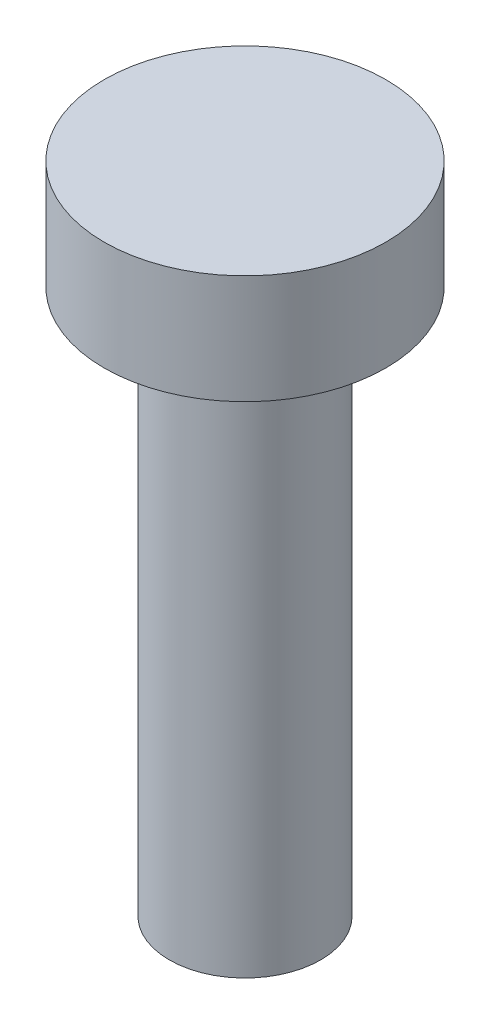
ISO-10303-21;
HEADER;
FILE_DESCRIPTION(('STEP AP214'),'2;1');
FILE_NAME('part.step','',(''),(''),'','','');
FILE_SCHEMA(('AUTOMOTIVE_DESIGN { 1 0 10303 214 1 1 1 1 }'));
ENDSEC;
DATA;
#1=APPLICATION_CONTEXT('core data for automotive mechanical design processes');
#2=APPLICATION_PROTOCOL_DEFINITION('international standard','automotive_design',2000,#1);
#3=PRODUCT_CONTEXT('',#1,'mechanical');
#4=PRODUCT('Part','Part','',(#3));
#5=PRODUCT_RELATED_PRODUCT_CATEGORY('part','',(#4));
#6=PRODUCT_DEFINITION_FORMATION('','',#4);
#7=PRODUCT_DEFINITION_CONTEXT('part definition',#1,'design');
#8=PRODUCT_DEFINITION('design','',#6,#7);
#9=PRODUCT_DEFINITION_SHAPE('','',#8);
#10=(LENGTH_UNIT() NAMED_UNIT(*) SI_UNIT(.MILLI.,.METRE.));
#11=(NAMED_UNIT(*) PLANE_ANGLE_UNIT() SI_UNIT($,.RADIAN.));
#12=(NAMED_UNIT(*) SI_UNIT($,.STERADIAN.) SOLID_ANGLE_UNIT());
#13=UNCERTAINTY_MEASURE_WITH_UNIT(LENGTH_MEASURE(1.E-05),#10,'distance_accuracy_value','');
#14=(GEOMETRIC_REPRESENTATION_CONTEXT(3) GLOBAL_UNCERTAINTY_ASSIGNED_CONTEXT((#13)) GLOBAL_UNIT_ASSIGNED_CONTEXT((#10,
#11,#12)) REPRESENTATION_CONTEXT('',''));
#15=CARTESIAN_POINT('',(0.,0.,0.));
#16=DIRECTION('',(0.,0.,1.));
#17=DIRECTION('',(1.,0.,0.));
#18=AXIS2_PLACEMENT_3D('',#15,#16,#17);
#19=CARTESIAN_POINT('',(0.,18.,0.));
#20=DIRECTION('',(0.,-1.,0.));
#21=DIRECTION('',(0.,0.,-1.));
#22=AXIS2_PLACEMENT_3D('',#19,#20,#21);
#23=CYLINDRICAL_SURFACE('',#22,2.5);
#24=CARTESIAN_POINT('',(0.,18.,0.));
#25=DIRECTION('',(0.,1.,0.));
#26=DIRECTION('',(0.,0.,1.));
#27=AXIS2_PLACEMENT_3D('',#24,#25,#26);
#28=CIRCLE('',#27,2.5);
#29=CARTESIAN_POINT('',(0.,18.,2.5));
#30=VERTEX_POINT('',#29);
#31=EDGE_CURVE('E10',#30,#30,#28,.T.);
#32=ORIENTED_EDGE('',*,*,#31,.F.);
#33=EDGE_LOOP('',(#32));
#34=FACE_BOUND('',#33,.T.);
#35=CARTESIAN_POINT('',(0.,0.,0.));
#36=DIRECTION('',(0.,1.,0.));
#37=DIRECTION('',(0.,0.,1.));
#38=AXIS2_PLACEMENT_3D('',#35,#36,#37);
#39=CIRCLE('',#38,2.5);
#40=CARTESIAN_POINT('',(0.,0.,2.5));
#41=VERTEX_POINT('',#40);
#42=EDGE_CURVE('E40',#41,#41,#39,.T.);
#43=ORIENTED_EDGE('',*,*,#42,.T.);
#44=EDGE_LOOP('',(#43));
#45=FACE_BOUND('',#44,.T.);
#46=ADVANCED_FACE('F37',(#34,#45),#23,.T.);
#47=CARTESIAN_POINT('',(0.,0.,0.));
#48=DIRECTION('',(0.,1.,0.));
#49=DIRECTION('',(0.,0.,1.));
#50=AXIS2_PLACEMENT_3D('',#47,#48,#49);
#51=PLANE('',#50);
#52=ORIENTED_EDGE('',*,*,#42,.F.);
#53=EDGE_LOOP('',(#52));
#54=FACE_BOUND('',#53,.T.);
#55=ADVANCED_FACE('F64',(#54),#51,.F.);
#56=CARTESIAN_POINT('',(0.,21.6,0.));
#57=DIRECTION('',(0.,-1.,0.));
#58=DIRECTION('',(0.,0.,-1.));
#59=AXIS2_PLACEMENT_3D('',#56,#57,#58);
#60=CYLINDRICAL_SURFACE('',#59,4.65);
#61=CARTESIAN_POINT('',(0.,21.6,0.));
#62=DIRECTION('',(0.,1.,0.));
#63=DIRECTION('',(0.,0.,1.));
#64=AXIS2_PLACEMENT_3D('',#61,#62,#63);
#65=CIRCLE('',#64,4.65);
#66=CARTESIAN_POINT('',(0.,21.6,4.65));
#67=VERTEX_POINT('',#66);
#68=EDGE_CURVE('E49',#67,#67,#65,.T.);
#69=ORIENTED_EDGE('',*,*,#68,.F.);
#70=EDGE_LOOP('',(#69));
#71=FACE_BOUND('',#70,.T.);
#72=CARTESIAN_POINT('',(0.,18.,0.));
#73=DIRECTION('',(0.,1.,0.));
#74=DIRECTION('',(0.,0.,1.));
#75=AXIS2_PLACEMENT_3D('',#72,#73,#74);
#76=CIRCLE('',#75,4.65);
#77=CARTESIAN_POINT('',(0.,18.,4.65));
#78=VERTEX_POINT('',#77);
#79=EDGE_CURVE('E51',#78,#78,#76,.T.);
#80=ORIENTED_EDGE('',*,*,#79,.T.);
#81=EDGE_LOOP('',(#80));
#82=FACE_BOUND('',#81,.T.);
#83=ADVANCED_FACE('F61',(#71,#82),#60,.T.);
#84=CARTESIAN_POINT('',(0.,21.6,0.));
#85=DIRECTION('',(0.,1.,0.));
#86=DIRECTION('',(0.,0.,1.));
#87=AXIS2_PLACEMENT_3D('',#84,#85,#86);
#88=PLANE('',#87);
#89=ORIENTED_EDGE('',*,*,#68,.T.);
#90=EDGE_LOOP('',(#89));
#91=FACE_BOUND('',#90,.T.);
#92=ADVANCED_FACE('F59',(#91),#88,.T.);
#93=CARTESIAN_POINT('',(0.,18.,0.));
#94=DIRECTION('',(0.,1.,0.));
#95=DIRECTION('',(0.,0.,1.));
#96=AXIS2_PLACEMENT_3D('',#93,#94,#95);
#97=PLANE('',#96);
#98=ORIENTED_EDGE('',*,*,#31,.T.);
#99=EDGE_LOOP('',(#98));
#100=FACE_BOUND('',#99,.T.);
#101=ORIENTED_EDGE('',*,*,#79,.F.);
#102=EDGE_LOOP('',(#101));
#103=FACE_BOUND('',#102,.T.);
#104=ADVANCED_FACE('F68',(#100,#103),#97,.F.);
#105=CLOSED_SHELL('',(#46,#55,#83,#92,#104));
#106=MANIFOLD_SOLID_BREP('B2',#105);
#107=ADVANCED_BREP_SHAPE_REPRESENTATION('',(#18,#106),#14);
#108=SHAPE_DEFINITION_REPRESENTATION(#9,#107);
ENDSEC;
END-ISO-10303-21;
